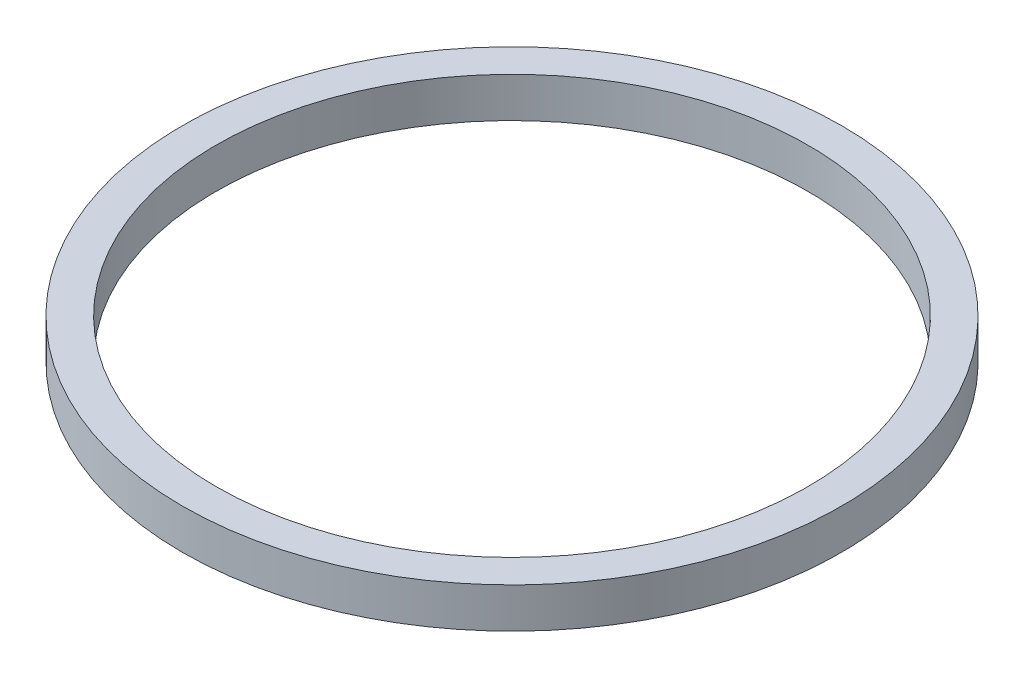
ISO-10303-21;
HEADER;
FILE_DESCRIPTION(('STEP AP214'),'2;1');
FILE_NAME('part.step','',(''),(''),'','','');
FILE_SCHEMA(('AUTOMOTIVE_DESIGN { 1 0 10303 214 1 1 1 1 }'));
ENDSEC;
DATA;
#1=APPLICATION_CONTEXT('core data for automotive mechanical design processes');
#2=APPLICATION_PROTOCOL_DEFINITION('international standard','automotive_design',2000,#1);
#3=PRODUCT_CONTEXT('',#1,'mechanical');
#4=PRODUCT('Part','Part','',(#3));
#5=PRODUCT_RELATED_PRODUCT_CATEGORY('part','',(#4));
#6=PRODUCT_DEFINITION_FORMATION('','',#4);
#7=PRODUCT_DEFINITION_CONTEXT('part definition',#1,'design');
#8=PRODUCT_DEFINITION('design','',#6,#7);
#9=PRODUCT_DEFINITION_SHAPE('','',#8);
#10=(LENGTH_UNIT() NAMED_UNIT(*) SI_UNIT(.MILLI.,.METRE.));
#11=(NAMED_UNIT(*) PLANE_ANGLE_UNIT() SI_UNIT($,.RADIAN.));
#12=(NAMED_UNIT(*) SI_UNIT($,.STERADIAN.) SOLID_ANGLE_UNIT());
#13=UNCERTAINTY_MEASURE_WITH_UNIT(LENGTH_MEASURE(1.E-05),#10,'distance_accuracy_value','');
#14=(GEOMETRIC_REPRESENTATION_CONTEXT(3) GLOBAL_UNCERTAINTY_ASSIGNED_CONTEXT((#13)) GLOBAL_UNIT_ASSIGNED_CONTEXT((#10,
#11,#12)) REPRESENTATION_CONTEXT('',''));
#15=CARTESIAN_POINT('',(0.,0.,0.));
#16=DIRECTION('',(0.,0.,1.));
#17=DIRECTION('',(1.,0.,0.));
#18=AXIS2_PLACEMENT_3D('',#15,#16,#17);
#19=CARTESIAN_POINT('',(1340.77009521127,-875.333041125126,-694.117887031246));
#20=DIRECTION('',(0.,1.,0.));
#21=DIRECTION('',(0.,0.,1.));
#22=AXIS2_PLACEMENT_3D('',#19,#20,#21);
#23=PLANE('',#22);
#24=CARTESIAN_POINT('',(1340.77009521127,-875.333041125126,-694.117887031246));
#25=DIRECTION('',(0.,1.,0.));
#26=DIRECTION('',(0.,0.,1.));
#27=AXIS2_PLACEMENT_3D('',#24,#25,#26);
#28=CIRCLE('',#27,12.332334519938);
#29=CARTESIAN_POINT('',(1340.77009521127,-875.333041125126,-681.785552511308));
#30=VERTEX_POINT('',#29);
#31=EDGE_CURVE('E10',#30,#30,#28,.T.);
#32=ORIENTED_EDGE('',*,*,#31,.T.);
#33=EDGE_LOOP('',(#32));
#34=FACE_BOUND('',#33,.T.);
#35=CARTESIAN_POINT('',(1340.77009521127,-875.333041125126,-694.117887031246));
#36=DIRECTION('',(0.,1.,0.));
#37=DIRECTION('',(0.,0.,1.));
#38=AXIS2_PLACEMENT_3D('',#35,#36,#37);
#39=CIRCLE('',#38,11.0718595589579);
#40=CARTESIAN_POINT('',(1340.77009521127,-875.333041125126,-683.046027472288));
#41=VERTEX_POINT('',#40);
#42=EDGE_CURVE('E48',#41,#41,#39,.T.);
#43=ORIENTED_EDGE('',*,*,#42,.F.);
#44=EDGE_LOOP('',(#43));
#45=FACE_BOUND('',#44,.T.);
#46=ADVANCED_FACE('F40',(#34,#45),#23,.T.);
#47=CARTESIAN_POINT('',(1340.77009521127,-876.833041125126,-694.117887031246));
#48=DIRECTION('',(0.,1.,0.));
#49=DIRECTION('',(0.,0.,1.));
#50=AXIS2_PLACEMENT_3D('',#47,#48,#49);
#51=PLANE('',#50);
#52=CARTESIAN_POINT('',(1340.77009521127,-876.833041125126,-694.117887031246));
#53=DIRECTION('',(0.,1.,0.));
#54=DIRECTION('',(0.,0.,1.));
#55=AXIS2_PLACEMENT_3D('',#52,#53,#54);
#56=CIRCLE('',#55,12.332334519938);
#57=CARTESIAN_POINT('',(1340.77009521127,-876.833041125126,-681.785552511308));
#58=VERTEX_POINT('',#57);
#59=EDGE_CURVE('E41',#58,#58,#56,.T.);
#60=ORIENTED_EDGE('',*,*,#59,.F.);
#61=EDGE_LOOP('',(#60));
#62=FACE_BOUND('',#61,.T.);
#63=CARTESIAN_POINT('',(1340.77009521127,-876.833041125126,-694.117887031246));
#64=DIRECTION('',(0.,1.,0.));
#65=DIRECTION('',(0.,0.,1.));
#66=AXIS2_PLACEMENT_3D('',#63,#64,#65);
#67=CIRCLE('',#66,11.0718595589579);
#68=CARTESIAN_POINT('',(1340.77009521127,-876.833041125126,-683.046027472288));
#69=VERTEX_POINT('',#68);
#70=EDGE_CURVE('E49',#69,#69,#67,.T.);
#71=ORIENTED_EDGE('',*,*,#70,.T.);
#72=EDGE_LOOP('',(#71));
#73=FACE_BOUND('',#72,.T.);
#74=ADVANCED_FACE('F58',(#62,#73),#51,.F.);
#75=CARTESIAN_POINT('',(1340.77009521127,-875.333041125126,-694.117887031246));
#76=DIRECTION('',(0.,-1.,0.));
#77=DIRECTION('',(0.,0.,-1.));
#78=AXIS2_PLACEMENT_3D('',#75,#76,#77);
#79=CYLINDRICAL_SURFACE('',#78,12.332334519938);
#80=ORIENTED_EDGE('',*,*,#31,.F.);
#81=EDGE_LOOP('',(#80));
#82=FACE_BOUND('',#81,.T.);
#83=ORIENTED_EDGE('',*,*,#59,.T.);
#84=EDGE_LOOP('',(#83));
#85=FACE_BOUND('',#84,.T.);
#86=ADVANCED_FACE('F39',(#82,#85),#79,.T.);
#87=CARTESIAN_POINT('',(1340.77009521127,-875.333041125126,-694.117887031246));
#88=DIRECTION('',(0.,-1.,0.));
#89=DIRECTION('',(0.,0.,-1.));
#90=AXIS2_PLACEMENT_3D('',#87,#88,#89);
#91=CYLINDRICAL_SURFACE('',#90,11.0718595589579);
#92=ORIENTED_EDGE('',*,*,#42,.T.);
#93=EDGE_LOOP('',(#92));
#94=FACE_BOUND('',#93,.T.);
#95=ORIENTED_EDGE('',*,*,#70,.F.);
#96=EDGE_LOOP('',(#95));
#97=FACE_BOUND('',#96,.T.);
#98=ADVANCED_FACE('F57',(#94,#97),#91,.F.);
#99=CLOSED_SHELL('',(#46,#74,#86,#98));
#100=MANIFOLD_SOLID_BREP('B2',#99);
#101=ADVANCED_BREP_SHAPE_REPRESENTATION('',(#18,#100),#14);
#102=SHAPE_DEFINITION_REPRESENTATION(#9,#101);
ENDSEC;
END-ISO-10303-21;
